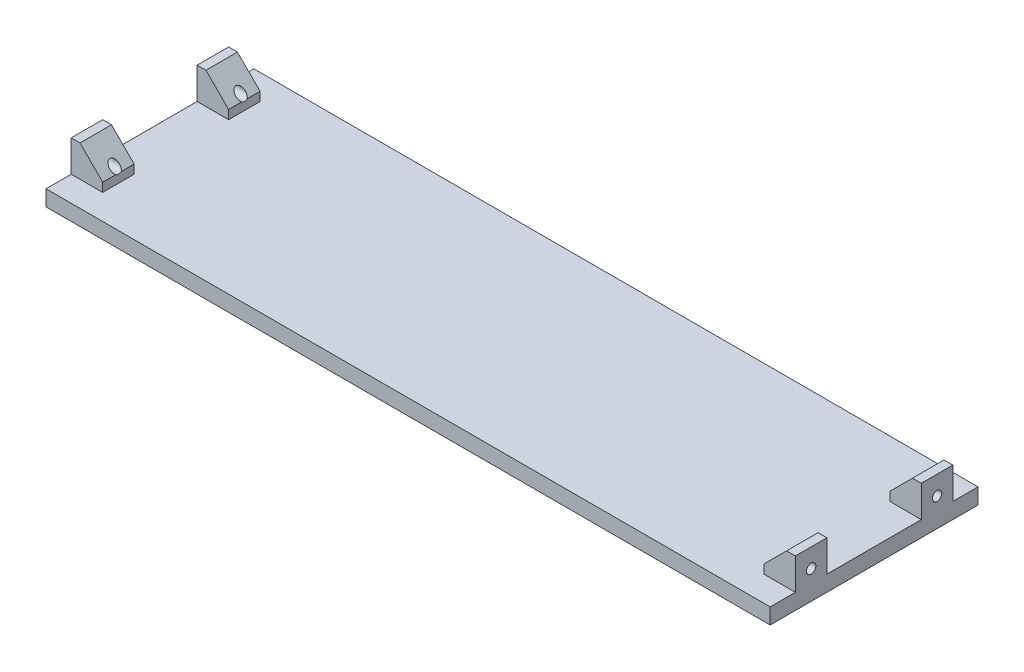
ISO-10303-21;
HEADER;
FILE_DESCRIPTION(('STEP AP214'),'2;1');
FILE_NAME('part.step','',(''),(''),'','','');
FILE_SCHEMA(('AUTOMOTIVE_DESIGN { 1 0 10303 214 1 1 1 1 }'));
ENDSEC;
DATA;
#1=APPLICATION_CONTEXT('core data for automotive mechanical design processes');
#2=APPLICATION_PROTOCOL_DEFINITION('international standard','automotive_design',2000,#1);
#3=PRODUCT_CONTEXT('',#1,'mechanical');
#4=PRODUCT('Part','Part','',(#3));
#5=PRODUCT_RELATED_PRODUCT_CATEGORY('part','',(#4));
#6=PRODUCT_DEFINITION_FORMATION('','',#4);
#7=PRODUCT_DEFINITION_CONTEXT('part definition',#1,'design');
#8=PRODUCT_DEFINITION('design','',#6,#7);
#9=PRODUCT_DEFINITION_SHAPE('','',#8);
#10=(LENGTH_UNIT() NAMED_UNIT(*) SI_UNIT(.MILLI.,.METRE.));
#11=(NAMED_UNIT(*) PLANE_ANGLE_UNIT() SI_UNIT($,.RADIAN.));
#12=(NAMED_UNIT(*) SI_UNIT($,.STERADIAN.) SOLID_ANGLE_UNIT());
#13=UNCERTAINTY_MEASURE_WITH_UNIT(LENGTH_MEASURE(1.E-05),#10,'distance_accuracy_value','');
#14=(GEOMETRIC_REPRESENTATION_CONTEXT(3) GLOBAL_UNCERTAINTY_ASSIGNED_CONTEXT((#13)) GLOBAL_UNIT_ASSIGNED_CONTEXT((#10,
#11,#12)) REPRESENTATION_CONTEXT('',''));
#15=CARTESIAN_POINT('',(0.,0.,0.));
#16=DIRECTION('',(0.,0.,1.));
#17=DIRECTION('',(1.,0.,0.));
#18=AXIS2_PLACEMENT_3D('',#15,#16,#17);
#19=CARTESIAN_POINT('',(0.,5.,0.));
#20=DIRECTION('',(0.,-1.,0.));
#21=DIRECTION('',(0.,0.,-1.));
#22=AXIS2_PLACEMENT_3D('',#19,#20,#21);
#23=PLANE('',#22);
#24=DIRECTION('',(1.,0.,0.));
#25=VECTOR('',#24,1.);
#26=CARTESIAN_POINT('',(-1.11022302462516E-13,5.,-15.));
#27=LINE('',#26,#25);
#28=CARTESIAN_POINT('',(-1.11022302462516E-13,5.,-15.));
#29=VERTEX_POINT('',#28);
#30=CARTESIAN_POINT('',(9.9999999999999,5.,-15.));
#31=VERTEX_POINT('',#30);
#32=EDGE_CURVE('E447',#29,#31,#27,.T.);
#33=ORIENTED_EDGE('',*,*,#32,.F.);
#34=DIRECTION('',(0.,0.,1.));
#35=VECTOR('',#34,1.);
#36=CARTESIAN_POINT('',(0.,5.,33.));
#37=LINE('',#36,#35);
#38=CARTESIAN_POINT('',(0.,5.,15.));
#39=VERTEX_POINT('',#38);
#40=EDGE_CURVE('E380',#29,#39,#37,.T.);
#41=ORIENTED_EDGE('',*,*,#40,.T.);
#42=DIRECTION('',(-1.,0.,0.));
#43=VECTOR('',#42,1.);
#44=CARTESIAN_POINT('',(0.,5.,15.));
#45=LINE('',#44,#43);
#46=CARTESIAN_POINT('',(10.,5.,15.));
#47=VERTEX_POINT('',#46);
#48=EDGE_CURVE('E344',#47,#39,#45,.T.);
#49=ORIENTED_EDGE('',*,*,#48,.F.);
#50=DIRECTION('',(0.,0.,-1.));
#51=VECTOR('',#50,1.);
#52=CARTESIAN_POINT('',(10.,5.,25.));
#53=LINE('',#52,#51);
#54=CARTESIAN_POINT('',(10.,5.,25.));
#55=VERTEX_POINT('',#54);
#56=EDGE_CURVE('E355',#55,#47,#53,.T.);
#57=ORIENTED_EDGE('',*,*,#56,.F.);
#58=DIRECTION('',(1.,0.,0.));
#59=VECTOR('',#58,1.);
#60=CARTESIAN_POINT('',(0.,5.,25.));
#61=LINE('',#60,#59);
#62=CARTESIAN_POINT('',(0.,5.,25.));
#63=VERTEX_POINT('',#62);
#64=EDGE_CURVE('E338',#63,#55,#61,.T.);
#65=ORIENTED_EDGE('',*,*,#64,.F.);
#66=CARTESIAN_POINT('',(0.,5.,33.));
#67=VERTEX_POINT('',#66);
#68=EDGE_CURVE('E381',#63,#67,#37,.T.);
#69=ORIENTED_EDGE('',*,*,#68,.T.);
#70=DIRECTION('',(1.,0.,0.));
#71=VECTOR('',#70,1.);
#72=CARTESIAN_POINT('',(0.,5.,33.));
#73=LINE('',#72,#71);
#74=CARTESIAN_POINT('',(230.,5.,33.));
#75=VERTEX_POINT('',#74);
#76=EDGE_CURVE('E379',#67,#75,#73,.T.);
#77=ORIENTED_EDGE('',*,*,#76,.T.);
#78=DIRECTION('',(0.,0.,-1.));
#79=VECTOR('',#78,1.);
#80=CARTESIAN_POINT('',(230.,5.,33.));
#81=LINE('',#80,#79);
#82=CARTESIAN_POINT('',(230.,5.,25.));
#83=VERTEX_POINT('',#82);
#84=EDGE_CURVE('E385',#75,#83,#81,.T.);
#85=ORIENTED_EDGE('',*,*,#84,.T.);
#86=DIRECTION('',(1.,0.,0.));
#87=VECTOR('',#86,1.);
#88=CARTESIAN_POINT('',(220.,5.,25.));
#89=LINE('',#88,#87);
#90=CARTESIAN_POINT('',(220.,5.,25.));
#91=VERTEX_POINT('',#90);
#92=EDGE_CURVE('E302',#91,#83,#89,.T.);
#93=ORIENTED_EDGE('',*,*,#92,.F.);
#94=DIRECTION('',(0.,0.,1.));
#95=VECTOR('',#94,1.);
#96=CARTESIAN_POINT('',(220.,5.,25.));
#97=LINE('',#96,#95);
#98=CARTESIAN_POINT('',(220.,4.99999999999999,15.));
#99=VERTEX_POINT('',#98);
#100=EDGE_CURVE('E307',#99,#91,#97,.T.);
#101=ORIENTED_EDGE('',*,*,#100,.F.);
#102=DIRECTION('',(-1.,0.,0.));
#103=VECTOR('',#102,1.);
#104=CARTESIAN_POINT('',(220.,4.99999999999999,15.));
#105=LINE('',#104,#103);
#106=CARTESIAN_POINT('',(230.,4.99999999999999,15.));
#107=VERTEX_POINT('',#106);
#108=EDGE_CURVE('E318',#107,#99,#105,.T.);
#109=ORIENTED_EDGE('',*,*,#108,.F.);
#110=CARTESIAN_POINT('',(230.,5.,-15.));
#111=VERTEX_POINT('',#110);
#112=EDGE_CURVE('E389',#107,#111,#81,.T.);
#113=ORIENTED_EDGE('',*,*,#112,.T.);
#114=DIRECTION('',(1.,0.,0.));
#115=VECTOR('',#114,1.);
#116=CARTESIAN_POINT('',(220.,5.,-15.));
#117=LINE('',#116,#115);
#118=CARTESIAN_POINT('',(220.,5.,-15.));
#119=VERTEX_POINT('',#118);
#120=EDGE_CURVE('E281',#119,#111,#117,.T.);
#121=ORIENTED_EDGE('',*,*,#120,.F.);
#122=DIRECTION('',(0.,0.,1.));
#123=VECTOR('',#122,1.);
#124=CARTESIAN_POINT('',(220.,5.,-15.));
#125=LINE('',#124,#123);
#126=CARTESIAN_POINT('',(220.,4.99999999999999,-25.));
#127=VERTEX_POINT('',#126);
#128=EDGE_CURVE('E289',#127,#119,#125,.T.);
#129=ORIENTED_EDGE('',*,*,#128,.F.);
#130=DIRECTION('',(-1.,0.,0.));
#131=VECTOR('',#130,1.);
#132=CARTESIAN_POINT('',(220.,4.99999999999999,-25.));
#133=LINE('',#132,#131);
#134=CARTESIAN_POINT('',(230.,4.99999999999999,-25.));
#135=VERTEX_POINT('',#134);
#136=EDGE_CURVE('E285',#135,#127,#133,.T.);
#137=ORIENTED_EDGE('',*,*,#136,.F.);
#138=CARTESIAN_POINT('',(230.,4.99999999999999,-33.));
#139=VERTEX_POINT('',#138);
#140=EDGE_CURVE('E384',#135,#139,#81,.T.);
#141=ORIENTED_EDGE('',*,*,#140,.T.);
#142=DIRECTION('',(-1.,0.,0.));
#143=VECTOR('',#142,1.);
#144=CARTESIAN_POINT('',(0.,5.,-33.));
#145=LINE('',#144,#143);
#146=CARTESIAN_POINT('',(0.,5.,-33.));
#147=VERTEX_POINT('',#146);
#148=EDGE_CURVE('E388',#139,#147,#145,.T.);
#149=ORIENTED_EDGE('',*,*,#148,.T.);
#150=CARTESIAN_POINT('',(0.,4.99999999999999,-25.));
#151=VERTEX_POINT('',#150);
#152=EDGE_CURVE('E376',#147,#151,#37,.T.);
#153=ORIENTED_EDGE('',*,*,#152,.T.);
#154=DIRECTION('',(-1.,0.,0.));
#155=VECTOR('',#154,1.);
#156=CARTESIAN_POINT('',(-1.11022302462516E-13,4.99999999999999,-25.));
#157=LINE('',#156,#155);
#158=CARTESIAN_POINT('',(9.9999999999999,4.99999999999999,-25.));
#159=VERTEX_POINT('',#158);
#160=EDGE_CURVE('E463',#159,#151,#157,.T.);
#161=ORIENTED_EDGE('',*,*,#160,.F.);
#162=DIRECTION('',(0.,0.,-1.));
#163=VECTOR('',#162,1.);
#164=CARTESIAN_POINT('',(9.9999999999999,5.,-15.));
#165=LINE('',#164,#163);
#166=EDGE_CURVE('E453',#31,#159,#165,.T.);
#167=ORIENTED_EDGE('',*,*,#166,.F.);
#168=EDGE_LOOP('',(#33,#41,#49,#57,#65,#69,#77,#85,#93,#101,#109,#113,#121,#129,#137,#141,#149,
#153,#161,#167));
#169=FACE_BOUND('',#168,.T.);
#170=ADVANCED_FACE('F58',(#169),#23,.F.);
#171=CARTESIAN_POINT('',(0.,5.,33.));
#172=DIRECTION('',(1.,0.,0.));
#173=DIRECTION('',(0.,0.,-1.));
#174=AXIS2_PLACEMENT_3D('',#171,#172,#173);
#175=PLANE('',#174);
#176=CARTESIAN_POINT('',(-1.11022302462516E-13,9.,20.));
#177=DIRECTION('',(1.,0.,0.));
#178=DIRECTION('',(0.,0.,-1.));
#179=AXIS2_PLACEMENT_3D('',#176,#177,#178);
#180=CIRCLE('',#179,1.5);
#181=CARTESIAN_POINT('',(-1.11022302462516E-13,9.,18.5));
#182=VERTEX_POINT('',#181);
#183=EDGE_CURVE('E425',#182,#182,#180,.T.);
#184=ORIENTED_EDGE('',*,*,#183,.T.);
#185=EDGE_LOOP('',(#184));
#186=FACE_BOUND('',#185,.T.);
#187=CARTESIAN_POINT('',(-1.11022302462516E-13,9.00000000000002,-20.));
#188=DIRECTION('',(1.,0.,0.));
#189=DIRECTION('',(0.,0.,-1.));
#190=AXIS2_PLACEMENT_3D('',#187,#188,#189);
#191=CIRCLE('',#190,1.5);
#192=CARTESIAN_POINT('',(-1.11022302462516E-13,9.00000000000002,-21.5));
#193=VERTEX_POINT('',#192);
#194=EDGE_CURVE('E557',#193,#193,#191,.T.);
#195=ORIENTED_EDGE('',*,*,#194,.T.);
#196=EDGE_LOOP('',(#195));
#197=FACE_BOUND('',#196,.T.);
#198=DIRECTION('',(0.,0.,1.));
#199=VECTOR('',#198,1.);
#200=CARTESIAN_POINT('',(0.,0.,33.));
#201=LINE('',#200,#199);
#202=CARTESIAN_POINT('',(0.,0.,-33.));
#203=VERTEX_POINT('',#202);
#204=CARTESIAN_POINT('',(0.,0.,33.));
#205=VERTEX_POINT('',#204);
#206=EDGE_CURVE('E375',#203,#205,#201,.T.);
#207=ORIENTED_EDGE('',*,*,#206,.T.);
#208=DIRECTION('',(0.,-1.,0.));
#209=VECTOR('',#208,1.);
#210=CARTESIAN_POINT('',(0.,5.,33.));
#211=LINE('',#210,#209);
#212=EDGE_CURVE('E416',#67,#205,#211,.T.);
#213=ORIENTED_EDGE('',*,*,#212,.F.);
#214=ORIENTED_EDGE('',*,*,#68,.F.);
#215=DIRECTION('',(0.,-1.,0.));
#216=VECTOR('',#215,1.);
#217=CARTESIAN_POINT('',(0.,15.,25.));
#218=LINE('',#217,#216);
#219=CARTESIAN_POINT('',(0.,15.,25.));
#220=VERTEX_POINT('',#219);
#221=EDGE_CURVE('E371',#220,#63,#218,.T.);
#222=ORIENTED_EDGE('',*,*,#221,.F.);
#223=DIRECTION('',(0.,0.,1.));
#224=VECTOR('',#223,1.);
#225=CARTESIAN_POINT('',(0.,15.,25.));
#226=LINE('',#225,#224);
#227=CARTESIAN_POINT('',(0.,15.,15.));
#228=VERTEX_POINT('',#227);
#229=EDGE_CURVE('E339',#228,#220,#226,.T.);
#230=ORIENTED_EDGE('',*,*,#229,.F.);
#231=DIRECTION('',(0.,-1.,0.));
#232=VECTOR('',#231,1.);
#233=CARTESIAN_POINT('',(0.,15.,15.));
#234=LINE('',#233,#232);
#235=EDGE_CURVE('E351',#228,#39,#234,.T.);
#236=ORIENTED_EDGE('',*,*,#235,.T.);
#237=ORIENTED_EDGE('',*,*,#40,.F.);
#238=DIRECTION('',(0.,-1.,0.));
#239=VECTOR('',#238,1.);
#240=CARTESIAN_POINT('',(-1.11022302462516E-13,15.,-15.));
#241=LINE('',#240,#239);
#242=CARTESIAN_POINT('',(-1.11022302462516E-13,15.,-15.));
#243=VERTEX_POINT('',#242);
#244=EDGE_CURVE('E468',#243,#29,#241,.T.);
#245=ORIENTED_EDGE('',*,*,#244,.F.);
#246=DIRECTION('',(0.,0.,1.));
#247=VECTOR('',#246,1.);
#248=CARTESIAN_POINT('',(-1.11022302462516E-13,15.,-15.));
#249=LINE('',#248,#247);
#250=CARTESIAN_POINT('',(-1.11022302462516E-13,15.,-25.));
#251=VERTEX_POINT('',#250);
#252=EDGE_CURVE('E466',#251,#243,#249,.T.);
#253=ORIENTED_EDGE('',*,*,#252,.F.);
#254=DIRECTION('',(0.,-1.,0.));
#255=VECTOR('',#254,1.);
#256=CARTESIAN_POINT('',(-1.11022302462516E-13,15.,-25.));
#257=LINE('',#256,#255);
#258=EDGE_CURVE('E479',#251,#151,#257,.T.);
#259=ORIENTED_EDGE('',*,*,#258,.T.);
#260=ORIENTED_EDGE('',*,*,#152,.F.);
#261=DIRECTION('',(0.,-1.,0.));
#262=VECTOR('',#261,1.);
#263=CARTESIAN_POINT('',(0.,5.,-33.));
#264=LINE('',#263,#262);
#265=EDGE_CURVE('E392',#147,#203,#264,.T.);
#266=ORIENTED_EDGE('',*,*,#265,.T.);
#267=EDGE_LOOP('',(#207,#213,#214,#222,#230,#236,#237,#245,#253,#259,#260,#266));
#268=FACE_BOUND('',#267,.T.);
#269=ADVANCED_FACE('F60',(#186,#197,#268),#175,.F.);
#270=CARTESIAN_POINT('',(0.,5.,33.));
#271=DIRECTION('',(0.,0.,-1.));
#272=DIRECTION('',(-1.,0.,0.));
#273=AXIS2_PLACEMENT_3D('',#270,#271,#272);
#274=PLANE('',#273);
#275=DIRECTION('',(1.,0.,0.));
#276=VECTOR('',#275,1.);
#277=CARTESIAN_POINT('',(0.,0.,33.));
#278=LINE('',#277,#276);
#279=CARTESIAN_POINT('',(230.,0.,33.));
#280=VERTEX_POINT('',#279);
#281=EDGE_CURVE('E396',#205,#280,#278,.T.);
#282=ORIENTED_EDGE('',*,*,#281,.T.);
#283=DIRECTION('',(0.,-1.,0.));
#284=VECTOR('',#283,1.);
#285=CARTESIAN_POINT('',(230.,5.,33.));
#286=LINE('',#285,#284);
#287=EDGE_CURVE('E412',#75,#280,#286,.T.);
#288=ORIENTED_EDGE('',*,*,#287,.F.);
#289=ORIENTED_EDGE('',*,*,#76,.F.);
#290=ORIENTED_EDGE('',*,*,#212,.T.);
#291=EDGE_LOOP('',(#282,#288,#289,#290));
#292=FACE_BOUND('',#291,.T.);
#293=ADVANCED_FACE('F660',(#292),#274,.F.);
#294=CARTESIAN_POINT('',(230.,5.,33.));
#295=DIRECTION('',(-1.,0.,0.));
#296=DIRECTION('',(0.,0.,1.));
#297=AXIS2_PLACEMENT_3D('',#294,#295,#296);
#298=PLANE('',#297);
#299=CARTESIAN_POINT('',(230.,9.,20.));
#300=DIRECTION('',(1.,0.,0.));
#301=DIRECTION('',(0.,0.,-1.));
#302=AXIS2_PLACEMENT_3D('',#299,#300,#301);
#303=CIRCLE('',#302,1.5);
#304=CARTESIAN_POINT('',(230.,9.,18.5));
#305=VERTEX_POINT('',#304);
#306=EDGE_CURVE('E564',#305,#305,#303,.T.);
#307=ORIENTED_EDGE('',*,*,#306,.F.);
#308=EDGE_LOOP('',(#307));
#309=FACE_BOUND('',#308,.T.);
#310=CARTESIAN_POINT('',(230.,9.00000000000002,-20.));
#311=DIRECTION('',(1.,0.,0.));
#312=DIRECTION('',(0.,0.,-1.));
#313=AXIS2_PLACEMENT_3D('',#310,#311,#312);
#314=CIRCLE('',#313,1.5);
#315=CARTESIAN_POINT('',(230.,9.00000000000002,-21.5));
#316=VERTEX_POINT('',#315);
#317=EDGE_CURVE('E550',#316,#316,#314,.T.);
#318=ORIENTED_EDGE('',*,*,#317,.F.);
#319=EDGE_LOOP('',(#318));
#320=FACE_BOUND('',#319,.T.);
#321=DIRECTION('',(0.,0.,-1.));
#322=VECTOR('',#321,1.);
#323=CARTESIAN_POINT('',(230.,0.,33.));
#324=LINE('',#323,#322);
#325=CARTESIAN_POINT('',(230.,0.,-33.));
#326=VERTEX_POINT('',#325);
#327=EDGE_CURVE('E399',#280,#326,#324,.T.);
#328=ORIENTED_EDGE('',*,*,#327,.T.);
#329=DIRECTION('',(0.,-1.,0.));
#330=VECTOR('',#329,1.);
#331=CARTESIAN_POINT('',(230.,4.99999999999999,-33.));
#332=LINE('',#331,#330);
#333=EDGE_CURVE('E408',#139,#326,#332,.T.);
#334=ORIENTED_EDGE('',*,*,#333,.F.);
#335=ORIENTED_EDGE('',*,*,#140,.F.);
#336=DIRECTION('',(0.,-1.,0.));
#337=VECTOR('',#336,1.);
#338=CARTESIAN_POINT('',(230.,15.,-25.));
#339=LINE('',#338,#337);
#340=CARTESIAN_POINT('',(230.,15.,-25.));
#341=VERTEX_POINT('',#340);
#342=EDGE_CURVE('E295',#341,#135,#339,.T.);
#343=ORIENTED_EDGE('',*,*,#342,.F.);
#344=DIRECTION('',(0.,0.,-1.));
#345=VECTOR('',#344,1.);
#346=CARTESIAN_POINT('',(230.,15.,-15.));
#347=LINE('',#346,#345);
#348=CARTESIAN_POINT('',(230.,15.,-15.));
#349=VERTEX_POINT('',#348);
#350=EDGE_CURVE('E267',#349,#341,#347,.T.);
#351=ORIENTED_EDGE('',*,*,#350,.F.);
#352=DIRECTION('',(0.,-1.,0.));
#353=VECTOR('',#352,1.);
#354=CARTESIAN_POINT('',(230.,15.,-15.));
#355=LINE('',#354,#353);
#356=EDGE_CURVE('E298',#349,#111,#355,.T.);
#357=ORIENTED_EDGE('',*,*,#356,.T.);
#358=ORIENTED_EDGE('',*,*,#112,.F.);
#359=DIRECTION('',(0.,-1.,0.));
#360=VECTOR('',#359,1.);
#361=CARTESIAN_POINT('',(230.,15.,15.));
#362=LINE('',#361,#360);
#363=CARTESIAN_POINT('',(230.,15.,15.));
#364=VERTEX_POINT('',#363);
#365=EDGE_CURVE('E330',#364,#107,#362,.T.);
#366=ORIENTED_EDGE('',*,*,#365,.F.);
#367=DIRECTION('',(0.,0.,-1.));
#368=VECTOR('',#367,1.);
#369=CARTESIAN_POINT('',(230.,15.,25.));
#370=LINE('',#369,#368);
#371=CARTESIAN_POINT('',(230.,15.,25.));
#372=VERTEX_POINT('',#371);
#373=EDGE_CURVE('E306',#372,#364,#370,.T.);
#374=ORIENTED_EDGE('',*,*,#373,.F.);
#375=DIRECTION('',(0.,-1.,0.));
#376=VECTOR('',#375,1.);
#377=CARTESIAN_POINT('',(230.,15.,25.));
#378=LINE('',#377,#376);
#379=EDGE_CURVE('E334',#372,#83,#378,.T.);
#380=ORIENTED_EDGE('',*,*,#379,.T.);
#381=ORIENTED_EDGE('',*,*,#84,.F.);
#382=ORIENTED_EDGE('',*,*,#287,.T.);
#383=EDGE_LOOP('',(#328,#334,#335,#343,#351,#357,#358,#366,#374,#380,#381,#382));
#384=FACE_BOUND('',#383,.T.);
#385=ADVANCED_FACE('F493',(#309,#320,#384),#298,.F.);
#386=CARTESIAN_POINT('',(0.,5.,-33.));
#387=DIRECTION('',(0.,0.,1.));
#388=DIRECTION('',(1.,0.,0.));
#389=AXIS2_PLACEMENT_3D('',#386,#387,#388);
#390=PLANE('',#389);
#391=DIRECTION('',(-1.,0.,0.));
#392=VECTOR('',#391,1.);
#393=CARTESIAN_POINT('',(0.,0.,-33.));
#394=LINE('',#393,#392);
#395=EDGE_CURVE('E402',#326,#203,#394,.T.);
#396=ORIENTED_EDGE('',*,*,#395,.T.);
#397=ORIENTED_EDGE('',*,*,#265,.F.);
#398=ORIENTED_EDGE('',*,*,#148,.F.);
#399=ORIENTED_EDGE('',*,*,#333,.T.);
#400=EDGE_LOOP('',(#396,#397,#398,#399));
#401=FACE_BOUND('',#400,.T.);
#402=ADVANCED_FACE('F653',(#401),#390,.F.);
#403=CARTESIAN_POINT('',(0.,0.,0.));
#404=DIRECTION('',(0.,-1.,0.));
#405=DIRECTION('',(0.,0.,-1.));
#406=AXIS2_PLACEMENT_3D('',#403,#404,#405);
#407=PLANE('',#406);
#408=ORIENTED_EDGE('',*,*,#206,.F.);
#409=ORIENTED_EDGE('',*,*,#395,.F.);
#410=ORIENTED_EDGE('',*,*,#327,.F.);
#411=ORIENTED_EDGE('',*,*,#281,.F.);
#412=EDGE_LOOP('',(#408,#409,#410,#411));
#413=FACE_BOUND('',#412,.T.);
#414=ADVANCED_FACE('F657',(#413),#407,.T.);
#415=CARTESIAN_POINT('',(0.,15.,25.));
#416=DIRECTION('',(0.,0.,-1.));
#417=DIRECTION('',(-1.,0.,0.));
#418=AXIS2_PLACEMENT_3D('',#415,#416,#417);
#419=PLANE('',#418);
#420=DIRECTION('',(0.,-1.,0.));
#421=VECTOR('',#420,1.);
#422=CARTESIAN_POINT('',(10.,15.,25.));
#423=LINE('',#422,#421);
#424=CARTESIAN_POINT('',(10.0000000000002,7.8,25.));
#425=VERTEX_POINT('',#424);
#426=EDGE_CURVE('E368',#425,#55,#423,.T.);
#427=ORIENTED_EDGE('',*,*,#426,.F.);
#428=DIRECTION('',(-0.707106781186548,0.707106781186547,0.));
#429=VECTOR('',#428,1.);
#430=CARTESIAN_POINT('',(1.40000000000007,16.4000000000001,25.));
#431=LINE('',#430,#429);
#432=CARTESIAN_POINT('',(2.80000000000025,15.,25.));
#433=VERTEX_POINT('',#432);
#434=EDGE_CURVE('E616',#425,#433,#431,.T.);
#435=ORIENTED_EDGE('',*,*,#434,.T.);
#436=DIRECTION('',(1.,0.,0.));
#437=VECTOR('',#436,1.);
#438=CARTESIAN_POINT('',(0.,15.,25.));
#439=LINE('',#438,#437);
#440=EDGE_CURVE('E343',#220,#433,#439,.T.);
#441=ORIENTED_EDGE('',*,*,#440,.F.);
#442=ORIENTED_EDGE('',*,*,#221,.T.);
#443=ORIENTED_EDGE('',*,*,#64,.T.);
#444=EDGE_LOOP('',(#427,#435,#441,#442,#443));
#445=FACE_BOUND('',#444,.T.);
#446=ADVANCED_FACE('F621',(#445),#419,.F.);
#447=CARTESIAN_POINT('',(10.,15.,25.));
#448=DIRECTION('',(-1.,0.,0.));
#449=DIRECTION('',(0.,0.,1.));
#450=AXIS2_PLACEMENT_3D('',#447,#448,#449);
#451=PLANE('',#450);
#452=DIRECTION('',(0.,-1.,0.));
#453=VECTOR('',#452,1.);
#454=CARTESIAN_POINT('',(10.,15.,15.));
#455=LINE('',#454,#453);
#456=CARTESIAN_POINT('',(10.0000000000002,7.8,15.));
#457=VERTEX_POINT('',#456);
#458=EDGE_CURVE('E365',#457,#47,#455,.T.);
#459=ORIENTED_EDGE('',*,*,#458,.F.);
#460=DIRECTION('',(0.,0.,-1.));
#461=VECTOR('',#460,1.);
#462=CARTESIAN_POINT('',(10.0000000000002,7.8,33.));
#463=LINE('',#462,#461);
#464=CARTESIAN_POINT('',(10.0000000000002,7.8,19.1));
#465=VERTEX_POINT('',#464);
#466=EDGE_CURVE('E445',#465,#457,#463,.T.);
#467=ORIENTED_EDGE('',*,*,#466,.F.);
#468=CARTESIAN_POINT('',(10.,9.,20.));
#469=DIRECTION('',(-1.,0.,0.));
#470=DIRECTION('',(0.,0.,1.));
#471=AXIS2_PLACEMENT_3D('',#468,#469,#470);
#472=CIRCLE('',#471,1.5);
#473=CARTESIAN_POINT('',(10.,7.8,20.9));
#474=VERTEX_POINT('',#473);
#475=EDGE_CURVE('E429',#465,#474,#472,.T.);
#476=ORIENTED_EDGE('',*,*,#475,.T.);
#477=EDGE_CURVE('E263',#425,#474,#463,.T.);
#478=ORIENTED_EDGE('',*,*,#477,.F.);
#479=ORIENTED_EDGE('',*,*,#426,.T.);
#480=ORIENTED_EDGE('',*,*,#56,.T.);
#481=EDGE_LOOP('',(#459,#467,#476,#478,#479,#480));
#482=FACE_BOUND('',#481,.T.);
#483=ADVANCED_FACE('F443',(#482),#451,.F.);
#484=CARTESIAN_POINT('',(0.,15.,15.));
#485=DIRECTION('',(0.,0.,1.));
#486=DIRECTION('',(1.,0.,0.));
#487=AXIS2_PLACEMENT_3D('',#484,#485,#486);
#488=PLANE('',#487);
#489=DIRECTION('',(-1.,0.,0.));
#490=VECTOR('',#489,1.);
#491=CARTESIAN_POINT('',(0.,15.,15.));
#492=LINE('',#491,#490);
#493=CARTESIAN_POINT('',(2.80000000000025,15.,15.));
#494=VERTEX_POINT('',#493);
#495=EDGE_CURVE('E348',#494,#228,#492,.T.);
#496=ORIENTED_EDGE('',*,*,#495,.F.);
#497=DIRECTION('',(0.707106781186548,-0.707106781186547,0.));
#498=VECTOR('',#497,1.);
#499=CARTESIAN_POINT('',(1.40000000000007,16.4000000000001,15.));
#500=LINE('',#499,#498);
#501=EDGE_CURVE('E609',#494,#457,#500,.T.);
#502=ORIENTED_EDGE('',*,*,#501,.T.);
#503=ORIENTED_EDGE('',*,*,#458,.T.);
#504=ORIENTED_EDGE('',*,*,#48,.T.);
#505=ORIENTED_EDGE('',*,*,#235,.F.);
#506=EDGE_LOOP('',(#496,#502,#503,#504,#505));
#507=FACE_BOUND('',#506,.T.);
#508=ADVANCED_FACE('F612',(#507),#488,.F.);
#509=CARTESIAN_POINT('',(0.,15.,0.));
#510=DIRECTION('',(0.,-1.,0.));
#511=DIRECTION('',(0.,0.,-1.));
#512=AXIS2_PLACEMENT_3D('',#509,#510,#511);
#513=PLANE('',#512);
#514=ORIENTED_EDGE('',*,*,#440,.T.);
#515=DIRECTION('',(0.,0.,-1.));
#516=VECTOR('',#515,1.);
#517=CARTESIAN_POINT('',(2.80000000000025,15.,33.));
#518=LINE('',#517,#516);
#519=EDGE_CURVE('E591',#433,#494,#518,.T.);
#520=ORIENTED_EDGE('',*,*,#519,.T.);
#521=ORIENTED_EDGE('',*,*,#495,.T.);
#522=ORIENTED_EDGE('',*,*,#229,.T.);
#523=EDGE_LOOP('',(#514,#520,#521,#522));
#524=FACE_BOUND('',#523,.T.);
#525=ADVANCED_FACE('F722',(#524),#513,.F.);
#526=CARTESIAN_POINT('',(220.,15.,25.));
#527=DIRECTION('',(0.,0.,-1.));
#528=DIRECTION('',(-1.,0.,0.));
#529=AXIS2_PLACEMENT_3D('',#526,#527,#528);
#530=PLANE('',#529);
#531=DIRECTION('',(1.,0.,0.));
#532=VECTOR('',#531,1.);
#533=CARTESIAN_POINT('',(220.,15.,25.));
#534=LINE('',#533,#532);
#535=CARTESIAN_POINT('',(227.2,15.,25.));
#536=VERTEX_POINT('',#535);
#537=EDGE_CURVE('E303',#536,#372,#534,.T.);
#538=ORIENTED_EDGE('',*,*,#537,.F.);
#539=DIRECTION('',(-0.707106781186548,-0.707106781186547,0.));
#540=VECTOR('',#539,1.);
#541=CARTESIAN_POINT('',(223.6,11.4000000000001,25.));
#542=LINE('',#541,#540);
#543=CARTESIAN_POINT('',(220.,7.8,25.));
#544=VERTEX_POINT('',#543);
#545=EDGE_CURVE('E547',#536,#544,#542,.T.);
#546=ORIENTED_EDGE('',*,*,#545,.T.);
#547=DIRECTION('',(0.,-1.,0.));
#548=VECTOR('',#547,1.);
#549=CARTESIAN_POINT('',(220.,15.,25.));
#550=LINE('',#549,#548);
#551=EDGE_CURVE('E314',#544,#91,#550,.T.);
#552=ORIENTED_EDGE('',*,*,#551,.T.);
#553=ORIENTED_EDGE('',*,*,#92,.T.);
#554=ORIENTED_EDGE('',*,*,#379,.F.);
#555=EDGE_LOOP('',(#538,#546,#552,#553,#554));
#556=FACE_BOUND('',#555,.T.);
#557=ADVANCED_FACE('F545',(#556),#530,.F.);
#558=CARTESIAN_POINT('',(220.,15.,15.));
#559=DIRECTION('',(0.,0.,1.));
#560=DIRECTION('',(1.,0.,0.));
#561=AXIS2_PLACEMENT_3D('',#558,#559,#560);
#562=PLANE('',#561);
#563=DIRECTION('',(0.,-1.,0.));
#564=VECTOR('',#563,1.);
#565=CARTESIAN_POINT('',(220.,15.,15.));
#566=LINE('',#565,#564);
#567=CARTESIAN_POINT('',(220.,7.79999999999999,15.));
#568=VERTEX_POINT('',#567);
#569=EDGE_CURVE('E327',#568,#99,#566,.T.);
#570=ORIENTED_EDGE('',*,*,#569,.F.);
#571=DIRECTION('',(0.707106781186548,0.707106781186547,0.));
#572=VECTOR('',#571,1.);
#573=CARTESIAN_POINT('',(223.6,11.4000000000001,15.));
#574=LINE('',#573,#572);
#575=CARTESIAN_POINT('',(227.2,15.,15.));
#576=VERTEX_POINT('',#575);
#577=EDGE_CURVE('E539',#568,#576,#574,.T.);
#578=ORIENTED_EDGE('',*,*,#577,.T.);
#579=DIRECTION('',(-1.,0.,0.));
#580=VECTOR('',#579,1.);
#581=CARTESIAN_POINT('',(220.,15.,15.));
#582=LINE('',#581,#580);
#583=EDGE_CURVE('E310',#364,#576,#582,.T.);
#584=ORIENTED_EDGE('',*,*,#583,.F.);
#585=ORIENTED_EDGE('',*,*,#365,.T.);
#586=ORIENTED_EDGE('',*,*,#108,.T.);
#587=EDGE_LOOP('',(#570,#578,#584,#585,#586));
#588=FACE_BOUND('',#587,.T.);
#589=ADVANCED_FACE('F537',(#588),#562,.F.);
#590=CARTESIAN_POINT('',(220.,15.,25.));
#591=DIRECTION('',(1.,0.,0.));
#592=DIRECTION('',(0.,0.,-1.));
#593=AXIS2_PLACEMENT_3D('',#590,#591,#592);
#594=PLANE('',#593);
#595=ORIENTED_EDGE('',*,*,#551,.F.);
#596=DIRECTION('',(0.,0.,-1.));
#597=VECTOR('',#596,1.);
#598=CARTESIAN_POINT('',(220.,7.8,33.));
#599=LINE('',#598,#597);
#600=CARTESIAN_POINT('',(220.,7.8,20.9));
#601=VERTEX_POINT('',#600);
#602=EDGE_CURVE('E510',#544,#601,#599,.T.);
#603=ORIENTED_EDGE('',*,*,#602,.T.);
#604=CARTESIAN_POINT('',(220.,9.,20.));
#605=DIRECTION('',(1.,0.,0.));
#606=DIRECTION('',(0.,0.,-1.));
#607=AXIS2_PLACEMENT_3D('',#604,#605,#606);
#608=CIRCLE('',#607,1.5);
#609=CARTESIAN_POINT('',(220.,7.80000000000016,19.0999999999998));
#610=VERTEX_POINT('',#609);
#611=EDGE_CURVE('E426',#601,#610,#608,.T.);
#612=ORIENTED_EDGE('',*,*,#611,.T.);
#613=EDGE_CURVE('E515',#610,#568,#599,.T.);
#614=ORIENTED_EDGE('',*,*,#613,.T.);
#615=ORIENTED_EDGE('',*,*,#569,.T.);
#616=ORIENTED_EDGE('',*,*,#100,.T.);
#617=EDGE_LOOP('',(#595,#603,#612,#614,#615,#616));
#618=FACE_BOUND('',#617,.T.);
#619=ADVANCED_FACE('F532',(#618),#594,.F.);
#620=CARTESIAN_POINT('',(0.,15.,0.));
#621=DIRECTION('',(0.,1.,0.));
#622=DIRECTION('',(0.,0.,1.));
#623=AXIS2_PLACEMENT_3D('',#620,#621,#622);
#624=PLANE('',#623);
#625=DIRECTION('',(0.,0.,-1.));
#626=VECTOR('',#625,1.);
#627=CARTESIAN_POINT('',(227.2,15.,33.));
#628=LINE('',#627,#626);
#629=EDGE_CURVE('E252',#536,#576,#628,.T.);
#630=ORIENTED_EDGE('',*,*,#629,.F.);
#631=ORIENTED_EDGE('',*,*,#537,.T.);
#632=ORIENTED_EDGE('',*,*,#373,.T.);
#633=ORIENTED_EDGE('',*,*,#583,.T.);
#634=EDGE_LOOP('',(#630,#631,#632,#633));
#635=FACE_BOUND('',#634,.T.);
#636=ADVANCED_FACE('F664',(#635),#624,.T.);
#637=CARTESIAN_POINT('',(220.,15.,-15.));
#638=DIRECTION('',(0.,0.,-1.));
#639=DIRECTION('',(-1.,0.,0.));
#640=AXIS2_PLACEMENT_3D('',#637,#638,#639);
#641=PLANE('',#640);
#642=DIRECTION('',(1.,0.,0.));
#643=VECTOR('',#642,1.);
#644=CARTESIAN_POINT('',(220.,15.,-15.));
#645=LINE('',#644,#643);
#646=CARTESIAN_POINT('',(227.2,15.,-15.));
#647=VERTEX_POINT('',#646);
#648=EDGE_CURVE('E277',#647,#349,#645,.T.);
#649=ORIENTED_EDGE('',*,*,#648,.F.);
#650=DIRECTION('',(-0.707106781186548,-0.707106781186547,0.));
#651=VECTOR('',#650,1.);
#652=CARTESIAN_POINT('',(223.6,11.4,-15.));
#653=LINE('',#652,#651);
#654=CARTESIAN_POINT('',(220.,7.8,-15.));
#655=VERTEX_POINT('',#654);
#656=EDGE_CURVE('E247',#647,#655,#653,.T.);
#657=ORIENTED_EDGE('',*,*,#656,.T.);
#658=DIRECTION('',(0.,-1.,0.));
#659=VECTOR('',#658,1.);
#660=CARTESIAN_POINT('',(220.,15.,-15.));
#661=LINE('',#660,#659);
#662=EDGE_CURVE('E270',#655,#119,#661,.T.);
#663=ORIENTED_EDGE('',*,*,#662,.T.);
#664=ORIENTED_EDGE('',*,*,#120,.T.);
#665=ORIENTED_EDGE('',*,*,#356,.F.);
#666=EDGE_LOOP('',(#649,#657,#663,#664,#665));
#667=FACE_BOUND('',#666,.T.);
#668=ADVANCED_FACE('F494',(#667),#641,.F.);
#669=CARTESIAN_POINT('',(220.,15.,-25.));
#670=DIRECTION('',(0.,0.,1.));
#671=DIRECTION('',(1.,0.,0.));
#672=AXIS2_PLACEMENT_3D('',#669,#670,#671);
#673=PLANE('',#672);
#674=DIRECTION('',(0.,-1.,0.));
#675=VECTOR('',#674,1.);
#676=CARTESIAN_POINT('',(220.,15.,-25.));
#677=LINE('',#676,#675);
#678=CARTESIAN_POINT('',(220.,7.79999999999999,-25.));
#679=VERTEX_POINT('',#678);
#680=EDGE_CURVE('E261',#679,#127,#677,.T.);
#681=ORIENTED_EDGE('',*,*,#680,.F.);
#682=DIRECTION('',(-0.707106781186548,-0.707106781186547,0.));
#683=VECTOR('',#682,1.);
#684=CARTESIAN_POINT('',(227.2,15.,-25.));
#685=LINE('',#684,#683);
#686=CARTESIAN_POINT('',(227.2,15.,-25.));
#687=VERTEX_POINT('',#686);
#688=EDGE_CURVE('E245',#687,#679,#685,.T.);
#689=ORIENTED_EDGE('',*,*,#688,.F.);
#690=DIRECTION('',(-1.,0.,0.));
#691=VECTOR('',#690,1.);
#692=CARTESIAN_POINT('',(220.,15.,-25.));
#693=LINE('',#692,#691);
#694=EDGE_CURVE('E259',#341,#687,#693,.T.);
#695=ORIENTED_EDGE('',*,*,#694,.F.);
#696=ORIENTED_EDGE('',*,*,#342,.T.);
#697=ORIENTED_EDGE('',*,*,#136,.T.);
#698=EDGE_LOOP('',(#681,#689,#695,#696,#697));
#699=FACE_BOUND('',#698,.T.);
#700=ADVANCED_FACE('F257',(#699),#673,.F.);
#701=CARTESIAN_POINT('',(220.,15.,-15.));
#702=DIRECTION('',(1.,0.,0.));
#703=DIRECTION('',(0.,0.,-1.));
#704=AXIS2_PLACEMENT_3D('',#701,#702,#703);
#705=PLANE('',#704);
#706=ORIENTED_EDGE('',*,*,#662,.F.);
#707=CARTESIAN_POINT('',(220.,7.79999999999999,-19.1));
#708=VERTEX_POINT('',#707);
#709=EDGE_CURVE('E508',#655,#708,#599,.T.);
#710=ORIENTED_EDGE('',*,*,#709,.T.);
#711=CARTESIAN_POINT('',(220.,9.00000000000002,-20.));
#712=DIRECTION('',(1.,0.,0.));
#713=DIRECTION('',(0.,0.,-1.));
#714=AXIS2_PLACEMENT_3D('',#711,#712,#713);
#715=CIRCLE('',#714,1.5);
#716=CARTESIAN_POINT('',(220.,7.80000000000001,-20.9000000000001));
#717=VERTEX_POINT('',#716);
#718=EDGE_CURVE('E424',#708,#717,#715,.T.);
#719=ORIENTED_EDGE('',*,*,#718,.T.);
#720=EDGE_CURVE('E82',#717,#679,#599,.T.);
#721=ORIENTED_EDGE('',*,*,#720,.T.);
#722=ORIENTED_EDGE('',*,*,#680,.T.);
#723=ORIENTED_EDGE('',*,*,#128,.T.);
#724=EDGE_LOOP('',(#706,#710,#719,#721,#722,#723));
#725=FACE_BOUND('',#724,.T.);
#726=ADVANCED_FACE('F503',(#725),#705,.F.);
#727=CARTESIAN_POINT('',(0.,15.,0.));
#728=DIRECTION('',(0.,1.,0.));
#729=DIRECTION('',(0.,0.,1.));
#730=AXIS2_PLACEMENT_3D('',#727,#728,#729);
#731=PLANE('',#730);
#732=EDGE_CURVE('E242',#647,#687,#628,.T.);
#733=ORIENTED_EDGE('',*,*,#732,.F.);
#734=ORIENTED_EDGE('',*,*,#648,.T.);
#735=ORIENTED_EDGE('',*,*,#350,.T.);
#736=ORIENTED_EDGE('',*,*,#694,.T.);
#737=EDGE_LOOP('',(#733,#734,#735,#736));
#738=FACE_BOUND('',#737,.T.);
#739=ADVANCED_FACE('F265',(#738),#731,.T.);
#740=CARTESIAN_POINT('',(-1.11022302462516E-13,15.,-15.));
#741=DIRECTION('',(0.,0.,-1.));
#742=DIRECTION('',(-1.,0.,0.));
#743=AXIS2_PLACEMENT_3D('',#740,#741,#742);
#744=PLANE('',#743);
#745=DIRECTION('',(0.,-1.,0.));
#746=VECTOR('',#745,1.);
#747=CARTESIAN_POINT('',(9.9999999999999,15.,-15.));
#748=LINE('',#747,#746);
#749=CARTESIAN_POINT('',(10.0000000000002,7.8,-15.));
#750=VERTEX_POINT('',#749);
#751=EDGE_CURVE('E286',#750,#31,#748,.T.);
#752=ORIENTED_EDGE('',*,*,#751,.F.);
#753=DIRECTION('',(-0.707106781186548,0.707106781186547,0.));
#754=VECTOR('',#753,1.);
#755=CARTESIAN_POINT('',(1.40000000000007,16.4000000000002,-15.));
#756=LINE('',#755,#754);
#757=CARTESIAN_POINT('',(2.80000000000025,15.,-15.));
#758=VERTEX_POINT('',#757);
#759=EDGE_CURVE('E526',#750,#758,#756,.T.);
#760=ORIENTED_EDGE('',*,*,#759,.T.);
#761=DIRECTION('',(1.,0.,0.));
#762=VECTOR('',#761,1.);
#763=CARTESIAN_POINT('',(-1.11022302462516E-13,15.,-15.));
#764=LINE('',#763,#762);
#765=EDGE_CURVE('E458',#243,#758,#764,.T.);
#766=ORIENTED_EDGE('',*,*,#765,.F.);
#767=ORIENTED_EDGE('',*,*,#244,.T.);
#768=ORIENTED_EDGE('',*,*,#32,.T.);
#769=EDGE_LOOP('',(#752,#760,#766,#767,#768));
#770=FACE_BOUND('',#769,.T.);
#771=ADVANCED_FACE('F639',(#770),#744,.F.);
#772=CARTESIAN_POINT('',(9.9999999999999,15.,-15.));
#773=DIRECTION('',(-1.,0.,0.));
#774=DIRECTION('',(0.,0.,1.));
#775=AXIS2_PLACEMENT_3D('',#772,#773,#774);
#776=PLANE('',#775);
#777=DIRECTION('',(0.,-1.,0.));
#778=VECTOR('',#777,1.);
#779=CARTESIAN_POINT('',(9.9999999999999,15.,-25.));
#780=LINE('',#779,#778);
#781=CARTESIAN_POINT('',(10.0000000000002,7.79999999999999,-25.));
#782=VERTEX_POINT('',#781);
#783=EDGE_CURVE('E483',#782,#159,#780,.T.);
#784=ORIENTED_EDGE('',*,*,#783,.F.);
#785=CARTESIAN_POINT('',(10.0000000000002,7.8,-20.9));
#786=VERTEX_POINT('',#785);
#787=EDGE_CURVE('E588',#786,#782,#463,.T.);
#788=ORIENTED_EDGE('',*,*,#787,.F.);
#789=CARTESIAN_POINT('',(9.9999999999999,9.00000000000002,-20.));
#790=DIRECTION('',(-1.,0.,0.));
#791=DIRECTION('',(0.,0.,1.));
#792=AXIS2_PLACEMENT_3D('',#789,#790,#791);
#793=CIRCLE('',#792,1.5);
#794=CARTESIAN_POINT('',(9.9999999999999,7.79999999999999,-19.1));
#795=VERTEX_POINT('',#794);
#796=EDGE_CURVE('E420',#786,#795,#793,.T.);
#797=ORIENTED_EDGE('',*,*,#796,.T.);
#798=EDGE_CURVE('E74',#750,#795,#463,.T.);
#799=ORIENTED_EDGE('',*,*,#798,.F.);
#800=ORIENTED_EDGE('',*,*,#751,.T.);
#801=ORIENTED_EDGE('',*,*,#166,.T.);
#802=EDGE_LOOP('',(#784,#788,#797,#799,#800,#801));
#803=FACE_BOUND('',#802,.T.);
#804=ADVANCED_FACE('F586',(#803),#776,.F.);
#805=CARTESIAN_POINT('',(-1.11022302462516E-13,15.,-25.));
#806=DIRECTION('',(0.,0.,1.));
#807=DIRECTION('',(1.,0.,0.));
#808=AXIS2_PLACEMENT_3D('',#805,#806,#807);
#809=PLANE('',#808);
#810=DIRECTION('',(-1.,0.,0.));
#811=VECTOR('',#810,1.);
#812=CARTESIAN_POINT('',(-1.11022302462516E-13,15.,-25.));
#813=LINE('',#812,#811);
#814=CARTESIAN_POINT('',(2.80000000000025,15.,-25.));
#815=VERTEX_POINT('',#814);
#816=EDGE_CURVE('E462',#815,#251,#813,.T.);
#817=ORIENTED_EDGE('',*,*,#816,.F.);
#818=DIRECTION('',(-0.707106781186548,0.707106781186547,0.));
#819=VECTOR('',#818,1.);
#820=CARTESIAN_POINT('',(2.80000000000025,15.,-25.));
#821=LINE('',#820,#819);
#822=EDGE_CURVE('E977',#782,#815,#821,.T.);
#823=ORIENTED_EDGE('',*,*,#822,.F.);
#824=ORIENTED_EDGE('',*,*,#783,.T.);
#825=ORIENTED_EDGE('',*,*,#160,.T.);
#826=ORIENTED_EDGE('',*,*,#258,.F.);
#827=EDGE_LOOP('',(#817,#823,#824,#825,#826));
#828=FACE_BOUND('',#827,.T.);
#829=ADVANCED_FACE('F645',(#828),#809,.F.);
#830=CARTESIAN_POINT('',(0.,15.,0.));
#831=DIRECTION('',(0.,1.,0.));
#832=DIRECTION('',(0.,0.,1.));
#833=AXIS2_PLACEMENT_3D('',#830,#831,#832);
#834=PLANE('',#833);
#835=EDGE_CURVE('E598',#758,#815,#518,.T.);
#836=ORIENTED_EDGE('',*,*,#835,.T.);
#837=ORIENTED_EDGE('',*,*,#816,.T.);
#838=ORIENTED_EDGE('',*,*,#252,.T.);
#839=ORIENTED_EDGE('',*,*,#765,.T.);
#840=EDGE_LOOP('',(#836,#837,#838,#839));
#841=FACE_BOUND('',#840,.T.);
#842=ADVANCED_FACE('F580',(#841),#834,.T.);
#843=CARTESIAN_POINT('',(-1.11022302462516E-13,9.00000000000002,-20.));
#844=DIRECTION('',(1.,0.,0.));
#845=DIRECTION('',(0.,0.,-1.));
#846=AXIS2_PLACEMENT_3D('',#843,#844,#845);
#847=CYLINDRICAL_SURFACE('',#846,1.5);
#848=ORIENTED_EDGE('',*,*,#194,.F.);
#849=EDGE_LOOP('',(#848));
#850=FACE_BOUND('',#849,.T.);
#851=ORIENTED_EDGE('',*,*,#796,.F.);
#852=CARTESIAN_POINT('',(8.80000000000025,9.00000000000002,-20.));
#853=DIRECTION('',(-0.707106781186547,-0.707106781186548,0.));
#854=DIRECTION('',(0.707106781186548,-0.707106781186547,0.));
#855=AXIS2_PLACEMENT_3D('',#852,#853,#854);
#856=ELLIPSE('',#855,2.12132034355965,1.5);
#857=EDGE_CURVE('E518',#786,#795,#856,.F.);
#858=ORIENTED_EDGE('',*,*,#857,.T.);
#859=EDGE_LOOP('',(#851,#858));
#860=FACE_BOUND('',#859,.T.);
#861=ADVANCED_FACE('F576',(#850,#860),#847,.F.);
#862=ORIENTED_EDGE('',*,*,#317,.T.);
#863=EDGE_LOOP('',(#862));
#864=FACE_BOUND('',#863,.T.);
#865=ORIENTED_EDGE('',*,*,#718,.F.);
#866=CARTESIAN_POINT('',(221.2,9.00000000000002,-20.));
#867=DIRECTION('',(0.707106781186547,-0.707106781186548,0.));
#868=DIRECTION('',(0.707106781186548,0.707106781186547,0.));
#869=AXIS2_PLACEMENT_3D('',#866,#867,#868);
#870=ELLIPSE('',#869,2.12132034355965,1.5);
#871=EDGE_CURVE('E927',#708,#717,#870,.F.);
#872=ORIENTED_EDGE('',*,*,#871,.T.);
#873=EDGE_LOOP('',(#865,#872));
#874=FACE_BOUND('',#873,.T.);
#875=ADVANCED_FACE('F579',(#864,#874),#847,.F.);
#876=CARTESIAN_POINT('',(-1.11022302462516E-13,9.,20.));
#877=DIRECTION('',(1.,0.,0.));
#878=DIRECTION('',(0.,0.,-1.));
#879=AXIS2_PLACEMENT_3D('',#876,#877,#878);
#880=CYLINDRICAL_SURFACE('',#879,1.5);
#881=ORIENTED_EDGE('',*,*,#306,.T.);
#882=EDGE_LOOP('',(#881));
#883=FACE_BOUND('',#882,.T.);
#884=ORIENTED_EDGE('',*,*,#611,.F.);
#885=CARTESIAN_POINT('',(221.2,9.,20.));
#886=DIRECTION('',(0.707106781186547,-0.707106781186548,0.));
#887=DIRECTION('',(0.707106781186548,0.707106781186547,0.));
#888=AXIS2_PLACEMENT_3D('',#885,#886,#887);
#889=ELLIPSE('',#888,2.12132034355965,1.5);
#890=EDGE_CURVE('E13',#601,#610,#889,.F.);
#891=ORIENTED_EDGE('',*,*,#890,.T.);
#892=EDGE_LOOP('',(#884,#891));
#893=FACE_BOUND('',#892,.T.);
#894=ADVANCED_FACE('F812',(#883,#893),#880,.F.);
#895=ORIENTED_EDGE('',*,*,#183,.F.);
#896=EDGE_LOOP('',(#895));
#897=FACE_BOUND('',#896,.T.);
#898=ORIENTED_EDGE('',*,*,#475,.F.);
#899=CARTESIAN_POINT('',(8.80000000000025,9.,20.));
#900=DIRECTION('',(-0.707106781186547,-0.707106781186548,0.));
#901=DIRECTION('',(0.707106781186548,-0.707106781186547,0.));
#902=AXIS2_PLACEMENT_3D('',#899,#900,#901);
#903=ELLIPSE('',#902,2.12132034355965,1.5);
#904=EDGE_CURVE('E67',#465,#474,#903,.F.);
#905=ORIENTED_EDGE('',*,*,#904,.T.);
#906=EDGE_LOOP('',(#898,#905));
#907=FACE_BOUND('',#906,.T.);
#908=ADVANCED_FACE('F437',(#897,#907),#880,.F.);
#909=CARTESIAN_POINT('',(2.80000000000025,15.,33.));
#910=DIRECTION('',(-0.707106781186547,-0.707106781186548,0.));
#911=DIRECTION('',(0.707106781186548,-0.707106781186547,0.));
#912=AXIS2_PLACEMENT_3D('',#909,#910,#911);
#913=PLANE('',#912);
#914=ORIENTED_EDGE('',*,*,#477,.T.);
#915=ORIENTED_EDGE('',*,*,#904,.F.);
#916=ORIENTED_EDGE('',*,*,#466,.T.);
#917=ORIENTED_EDGE('',*,*,#501,.F.);
#918=ORIENTED_EDGE('',*,*,#519,.F.);
#919=ORIENTED_EDGE('',*,*,#434,.F.);
#920=EDGE_LOOP('',(#914,#915,#916,#917,#918,#919));
#921=FACE_BOUND('',#920,.T.);
#922=ADVANCED_FACE('F608',(#921),#913,.F.);
#923=CARTESIAN_POINT('',(227.2,15.,33.));
#924=DIRECTION('',(0.707106781186547,-0.707106781186548,0.));
#925=DIRECTION('',(0.707106781186548,0.707106781186547,0.));
#926=AXIS2_PLACEMENT_3D('',#923,#924,#925);
#927=PLANE('',#926);
#928=ORIENTED_EDGE('',*,*,#629,.T.);
#929=ORIENTED_EDGE('',*,*,#577,.F.);
#930=ORIENTED_EDGE('',*,*,#613,.F.);
#931=ORIENTED_EDGE('',*,*,#890,.F.);
#932=ORIENTED_EDGE('',*,*,#602,.F.);
#933=ORIENTED_EDGE('',*,*,#545,.F.);
#934=EDGE_LOOP('',(#928,#929,#930,#931,#932,#933));
#935=FACE_BOUND('',#934,.T.);
#936=ADVANCED_FACE('F665',(#935),#927,.F.);
#937=ORIENTED_EDGE('',*,*,#732,.T.);
#938=ORIENTED_EDGE('',*,*,#688,.T.);
#939=ORIENTED_EDGE('',*,*,#720,.F.);
#940=ORIENTED_EDGE('',*,*,#871,.F.);
#941=ORIENTED_EDGE('',*,*,#709,.F.);
#942=ORIENTED_EDGE('',*,*,#656,.F.);
#943=EDGE_LOOP('',(#937,#938,#939,#940,#941,#942));
#944=FACE_BOUND('',#943,.T.);
#945=ADVANCED_FACE('F244',(#944),#927,.F.);
#946=ORIENTED_EDGE('',*,*,#798,.T.);
#947=ORIENTED_EDGE('',*,*,#857,.F.);
#948=ORIENTED_EDGE('',*,*,#787,.T.);
#949=ORIENTED_EDGE('',*,*,#822,.T.);
#950=ORIENTED_EDGE('',*,*,#835,.F.);
#951=ORIENTED_EDGE('',*,*,#759,.F.);
#952=EDGE_LOOP('',(#946,#947,#948,#949,#950,#951));
#953=FACE_BOUND('',#952,.T.);
#954=ADVANCED_FACE('F672',(#953),#913,.F.);
#955=CLOSED_SHELL('',(#170,#269,#293,#385,#402,#414,#446,#483,#508,#525,#557,#589,#619,#636,
#668,#700,#726,#739,#771,#804,#829,#842,#861,#875,#894,#908,#922,#936,#945,#954));
#956=MANIFOLD_SOLID_BREP('B2',#955);
#957=ADVANCED_BREP_SHAPE_REPRESENTATION('',(#18,#956),#14);
#958=SHAPE_DEFINITION_REPRESENTATION(#9,#957);
ENDSEC;
END-ISO-10303-21;
